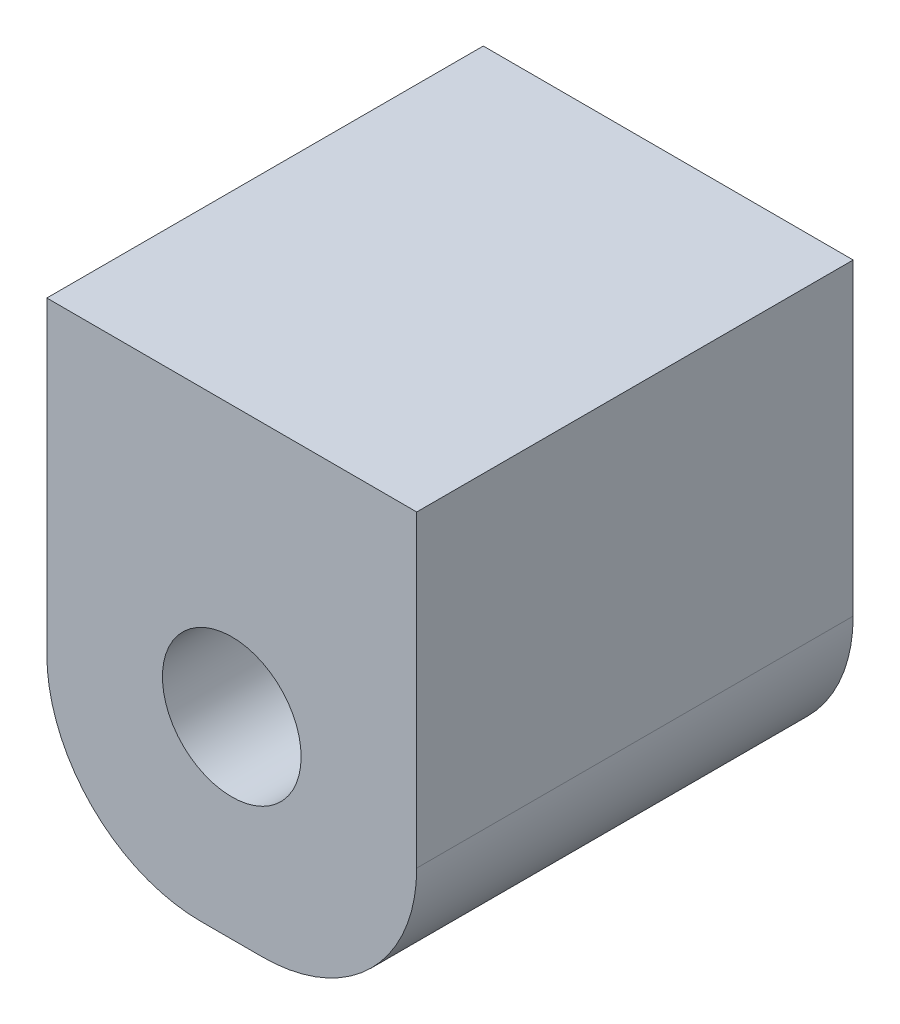
ISO-10303-21;
HEADER;
FILE_DESCRIPTION(('STEP AP214'),'2;1');
FILE_NAME('part.step','',(''),(''),'','','');
FILE_SCHEMA(('AUTOMOTIVE_DESIGN { 1 0 10303 214 1 1 1 1 }'));
ENDSEC;
DATA;
#1=APPLICATION_CONTEXT('core data for automotive mechanical design processes');
#2=APPLICATION_PROTOCOL_DEFINITION('international standard','automotive_design',2000,#1);
#3=PRODUCT_CONTEXT('',#1,'mechanical');
#4=PRODUCT('Part','Part','',(#3));
#5=PRODUCT_RELATED_PRODUCT_CATEGORY('part','',(#4));
#6=PRODUCT_DEFINITION_FORMATION('','',#4);
#7=PRODUCT_DEFINITION_CONTEXT('part definition',#1,'design');
#8=PRODUCT_DEFINITION('design','',#6,#7);
#9=PRODUCT_DEFINITION_SHAPE('','',#8);
#10=(LENGTH_UNIT() NAMED_UNIT(*) SI_UNIT(.MILLI.,.METRE.));
#11=(NAMED_UNIT(*) PLANE_ANGLE_UNIT() SI_UNIT($,.RADIAN.));
#12=(NAMED_UNIT(*) SI_UNIT($,.STERADIAN.) SOLID_ANGLE_UNIT());
#13=UNCERTAINTY_MEASURE_WITH_UNIT(LENGTH_MEASURE(1.E-05),#10,'distance_accuracy_value','');
#14=(GEOMETRIC_REPRESENTATION_CONTEXT(3) GLOBAL_UNCERTAINTY_ASSIGNED_CONTEXT((#13)) GLOBAL_UNIT_ASSIGNED_CONTEXT((#10,
#11,#12)) REPRESENTATION_CONTEXT('',''));
#15=CARTESIAN_POINT('',(0.,0.,0.));
#16=DIRECTION('',(0.,0.,1.));
#17=DIRECTION('',(1.,0.,0.));
#18=AXIS2_PLACEMENT_3D('',#15,#16,#17);
#19=CARTESIAN_POINT('',(0.,0.,28.32));
#20=DIRECTION('',(0.,0.,-1.));
#21=DIRECTION('',(-1.,0.,0.));
#22=AXIS2_PLACEMENT_3D('',#19,#20,#21);
#23=PLANE('',#22);
#24=DIRECTION('',(0.,-1.,0.));
#25=VECTOR('',#24,1.);
#26=CARTESIAN_POINT('',(14.5277983879841,-5.04493300678446,28.32));
#27=LINE('',#26,#25);
#28=CARTESIAN_POINT('',(14.5277983879841,-0.00856937765331077,28.32));
#29=VERTEX_POINT('',#28);
#30=CARTESIAN_POINT('',(14.5277983879841,-20.0449330067845,28.32));
#31=VERTEX_POINT('',#30);
#32=EDGE_CURVE('E123',#29,#31,#27,.T.);
#33=ORIENTED_EDGE('',*,*,#32,.T.);
#34=CARTESIAN_POINT('',(24.5277983879841,-20.0449330067845,28.32));
#35=DIRECTION('',(0.,0.,-1.));
#36=DIRECTION('',(-1.,0.,0.));
#37=AXIS2_PLACEMENT_3D('',#34,#35,#36);
#38=CIRCLE('',#37,10.);
#39=CARTESIAN_POINT('',(24.5277983879841,-30.0449330067845,28.32));
#40=VERTEX_POINT('',#39);
#41=EDGE_CURVE('E52',#31,#40,#38,.F.);
#42=ORIENTED_EDGE('',*,*,#41,.T.);
#43=DIRECTION('',(1.,0.,0.));
#44=VECTOR('',#43,1.);
#45=CARTESIAN_POINT('',(38.5277983879841,-30.0449330067845,28.32));
#46=LINE('',#45,#44);
#47=CARTESIAN_POINT('',(28.5277983879841,-30.0449330067845,28.32));
#48=VERTEX_POINT('',#47);
#49=EDGE_CURVE('E106',#40,#48,#46,.T.);
#50=ORIENTED_EDGE('',*,*,#49,.T.);
#51=CARTESIAN_POINT('',(28.5277983879841,-20.0449330067845,28.32));
#52=DIRECTION('',(0.,0.,-1.));
#53=DIRECTION('',(-1.,0.,0.));
#54=AXIS2_PLACEMENT_3D('',#51,#52,#53);
#55=CIRCLE('',#54,10.);
#56=CARTESIAN_POINT('',(38.5277983879841,-20.0449330067845,28.32));
#57=VERTEX_POINT('',#56);
#58=EDGE_CURVE('E59',#48,#57,#55,.F.);
#59=ORIENTED_EDGE('',*,*,#58,.T.);
#60=DIRECTION('',(0.,1.,0.));
#61=VECTOR('',#60,1.);
#62=CARTESIAN_POINT('',(38.5277983879841,-5.04493300678446,28.32));
#63=LINE('',#62,#61);
#64=CARTESIAN_POINT('',(38.5277983879841,-0.0328118142942987,28.32));
#65=VERTEX_POINT('',#64);
#66=EDGE_CURVE('E97',#57,#65,#63,.T.);
#67=ORIENTED_EDGE('',*,*,#66,.T.);
#68=DIRECTION('',(-0.999999489847843,0.00101010101140236,0.));
#69=VECTOR('',#68,1.);
#70=CARTESIAN_POINT('',(14.5277983879841,-0.00856937765331077,28.32));
#71=LINE('',#70,#69);
#72=EDGE_CURVE('E101',#65,#29,#71,.T.);
#73=ORIENTED_EDGE('',*,*,#72,.T.);
#74=EDGE_LOOP('',(#33,#42,#50,#59,#67,#73));
#75=FACE_BOUND('',#74,.T.);
#76=CARTESIAN_POINT('',(26.5277983879841,-17.5449330067845,28.32));
#77=DIRECTION('',(0.,0.,1.));
#78=DIRECTION('',(1.,0.,0.));
#79=AXIS2_PLACEMENT_3D('',#76,#77,#78);
#80=CIRCLE('',#79,4.5);
#81=CARTESIAN_POINT('',(31.0277983879841,-17.5449330067845,28.32));
#82=VERTEX_POINT('',#81);
#83=EDGE_CURVE('E133',#82,#82,#80,.T.);
#84=ORIENTED_EDGE('',*,*,#83,.F.);
#85=EDGE_LOOP('',(#84));
#86=FACE_BOUND('',#85,.T.);
#87=ADVANCED_FACE('F43',(#75,#86),#23,.F.);
#88=CARTESIAN_POINT('',(0.,0.,0.));
#89=DIRECTION('',(0.,0.,-1.));
#90=DIRECTION('',(-1.,0.,0.));
#91=AXIS2_PLACEMENT_3D('',#88,#89,#90);
#92=PLANE('',#91);
#93=DIRECTION('',(1.,0.,0.));
#94=VECTOR('',#93,1.);
#95=CARTESIAN_POINT('',(38.5277983879841,-30.0449330067845,0.));
#96=LINE('',#95,#94);
#97=CARTESIAN_POINT('',(24.5277983879841,-30.0449330067845,0.));
#98=VERTEX_POINT('',#97);
#99=CARTESIAN_POINT('',(28.5277983879841,-30.0449330067845,0.));
#100=VERTEX_POINT('',#99);
#101=EDGE_CURVE('E129',#98,#100,#96,.T.);
#102=ORIENTED_EDGE('',*,*,#101,.F.);
#103=CARTESIAN_POINT('',(24.5277983879841,-20.0449330067845,0.));
#104=DIRECTION('',(0.,0.,-1.));
#105=DIRECTION('',(-1.,0.,0.));
#106=AXIS2_PLACEMENT_3D('',#103,#104,#105);
#107=CIRCLE('',#106,10.);
#108=CARTESIAN_POINT('',(14.5277983879841,-20.0449330067845,0.));
#109=VERTEX_POINT('',#108);
#110=EDGE_CURVE('E153',#98,#109,#107,.T.);
#111=ORIENTED_EDGE('',*,*,#110,.T.);
#112=DIRECTION('',(0.,-1.,0.));
#113=VECTOR('',#112,1.);
#114=CARTESIAN_POINT('',(14.5277983879841,-30.0449330067845,0.));
#115=LINE('',#114,#113);
#116=CARTESIAN_POINT('',(14.5277983879841,-0.00856937765331077,0.));
#117=VERTEX_POINT('',#116);
#118=EDGE_CURVE('E139',#117,#109,#115,.T.);
#119=ORIENTED_EDGE('',*,*,#118,.F.);
#120=DIRECTION('',(-0.999999489847843,0.00101010101140236,0.));
#121=VECTOR('',#120,1.);
#122=CARTESIAN_POINT('',(14.5277983879841,-0.00856937765331077,0.));
#123=LINE('',#122,#121);
#124=CARTESIAN_POINT('',(38.5277983879841,-0.0328118142942987,0.));
#125=VERTEX_POINT('',#124);
#126=EDGE_CURVE('E136',#125,#117,#123,.T.);
#127=ORIENTED_EDGE('',*,*,#126,.F.);
#128=DIRECTION('',(0.,1.,0.));
#129=VECTOR('',#128,1.);
#130=CARTESIAN_POINT('',(38.5277983879841,-5.04493300678446,0.));
#131=LINE('',#130,#129);
#132=CARTESIAN_POINT('',(38.5277983879841,-20.0449330067845,0.));
#133=VERTEX_POINT('',#132);
#134=EDGE_CURVE('E112',#133,#125,#131,.T.);
#135=ORIENTED_EDGE('',*,*,#134,.F.);
#136=CARTESIAN_POINT('',(28.5277983879841,-20.0449330067845,0.));
#137=DIRECTION('',(0.,0.,-1.));
#138=DIRECTION('',(-1.,0.,0.));
#139=AXIS2_PLACEMENT_3D('',#136,#137,#138);
#140=CIRCLE('',#139,10.);
#141=EDGE_CURVE('E150',#133,#100,#140,.T.);
#142=ORIENTED_EDGE('',*,*,#141,.T.);
#143=EDGE_LOOP('',(#102,#111,#119,#127,#135,#142));
#144=FACE_BOUND('',#143,.T.);
#145=CARTESIAN_POINT('',(26.5277983879841,-17.5449330067845,0.));
#146=DIRECTION('',(0.,0.,1.));
#147=DIRECTION('',(1.,0.,0.));
#148=AXIS2_PLACEMENT_3D('',#145,#146,#147);
#149=CIRCLE('',#148,4.5);
#150=CARTESIAN_POINT('',(31.0277983879841,-17.5449330067845,0.));
#151=VERTEX_POINT('',#150);
#152=EDGE_CURVE('E276',#151,#151,#149,.T.);
#153=ORIENTED_EDGE('',*,*,#152,.T.);
#154=EDGE_LOOP('',(#153));
#155=FACE_BOUND('',#154,.T.);
#156=ADVANCED_FACE('F171',(#144,#155),#92,.T.);
#157=CARTESIAN_POINT('',(38.5277983879841,-30.0449330067845,28.32));
#158=DIRECTION('',(0.,1.,0.));
#159=DIRECTION('',(-1.,0.,0.));
#160=AXIS2_PLACEMENT_3D('',#157,#158,#159);
#161=PLANE('',#160);
#162=ORIENTED_EDGE('',*,*,#49,.F.);
#163=DIRECTION('',(0.,0.,-1.));
#164=VECTOR('',#163,1.);
#165=CARTESIAN_POINT('',(24.5277983879841,-30.0449330067845,28.32));
#166=LINE('',#165,#164);
#167=EDGE_CURVE('E146',#40,#98,#166,.T.);
#168=ORIENTED_EDGE('',*,*,#167,.T.);
#169=ORIENTED_EDGE('',*,*,#101,.T.);
#170=DIRECTION('',(0.,0.,-1.));
#171=VECTOR('',#170,1.);
#172=CARTESIAN_POINT('',(28.5277983879841,-30.0449330067845,28.32));
#173=LINE('',#172,#171);
#174=EDGE_CURVE('E117',#100,#48,#173,.F.);
#175=ORIENTED_EDGE('',*,*,#174,.T.);
#176=EDGE_LOOP('',(#162,#168,#169,#175));
#177=FACE_BOUND('',#176,.T.);
#178=ADVANCED_FACE('F165',(#177),#161,.F.);
#179=CARTESIAN_POINT('',(38.5277983879841,-5.04493300678446,28.32));
#180=DIRECTION('',(-1.,0.,0.));
#181=DIRECTION('',(0.,0.,1.));
#182=AXIS2_PLACEMENT_3D('',#179,#180,#181);
#183=PLANE('',#182);
#184=ORIENTED_EDGE('',*,*,#66,.F.);
#185=DIRECTION('',(0.,0.,-1.));
#186=VECTOR('',#185,1.);
#187=CARTESIAN_POINT('',(38.5277983879841,-20.0449330067845,28.32));
#188=LINE('',#187,#186);
#189=EDGE_CURVE('E11',#57,#133,#188,.T.);
#190=ORIENTED_EDGE('',*,*,#189,.T.);
#191=ORIENTED_EDGE('',*,*,#134,.T.);
#192=DIRECTION('',(0.,0.,-1.));
#193=VECTOR('',#192,1.);
#194=CARTESIAN_POINT('',(38.5277983879841,-0.0328118142942987,28.32));
#195=LINE('',#194,#193);
#196=EDGE_CURVE('E109',#65,#125,#195,.T.);
#197=ORIENTED_EDGE('',*,*,#196,.F.);
#198=EDGE_LOOP('',(#184,#190,#191,#197));
#199=FACE_BOUND('',#198,.T.);
#200=ADVANCED_FACE('F110',(#199),#183,.F.);
#201=CARTESIAN_POINT('',(14.5277983879841,-0.00856937765331077,28.32));
#202=DIRECTION('',(-0.00101010101140236,-0.999999489847843,0.));
#203=DIRECTION('',(0.999999489847843,-0.00101010101140236,0.));
#204=AXIS2_PLACEMENT_3D('',#201,#202,#203);
#205=PLANE('',#204);
#206=ORIENTED_EDGE('',*,*,#126,.T.);
#207=DIRECTION('',(0.,0.,-1.));
#208=VECTOR('',#207,1.);
#209=CARTESIAN_POINT('',(14.5277983879841,-0.00856937765331077,28.32));
#210=LINE('',#209,#208);
#211=EDGE_CURVE('E118',#29,#117,#210,.T.);
#212=ORIENTED_EDGE('',*,*,#211,.F.);
#213=ORIENTED_EDGE('',*,*,#72,.F.);
#214=ORIENTED_EDGE('',*,*,#196,.T.);
#215=EDGE_LOOP('',(#206,#212,#213,#214));
#216=FACE_BOUND('',#215,.T.);
#217=ADVANCED_FACE('F120',(#216),#205,.F.);
#218=CARTESIAN_POINT('',(14.5277983879841,-30.0449330067845,28.32));
#219=DIRECTION('',(1.,0.,0.));
#220=DIRECTION('',(0.,1.,0.));
#221=AXIS2_PLACEMENT_3D('',#218,#219,#220);
#222=PLANE('',#221);
#223=ORIENTED_EDGE('',*,*,#118,.T.);
#224=DIRECTION('',(0.,0.,-1.));
#225=VECTOR('',#224,1.);
#226=CARTESIAN_POINT('',(14.5277983879841,-20.0449330067845,28.32));
#227=LINE('',#226,#225);
#228=EDGE_CURVE('E67',#109,#31,#227,.F.);
#229=ORIENTED_EDGE('',*,*,#228,.T.);
#230=ORIENTED_EDGE('',*,*,#32,.F.);
#231=ORIENTED_EDGE('',*,*,#211,.T.);
#232=EDGE_LOOP('',(#223,#229,#230,#231));
#233=FACE_BOUND('',#232,.T.);
#234=ADVANCED_FACE('F173',(#233),#222,.F.);
#235=CARTESIAN_POINT('',(26.5277983879841,-17.5449330067845,28.32));
#236=DIRECTION('',(0.,0.,-1.));
#237=DIRECTION('',(-1.,0.,0.));
#238=AXIS2_PLACEMENT_3D('',#235,#236,#237);
#239=CYLINDRICAL_SURFACE('',#238,4.5);
#240=ORIENTED_EDGE('',*,*,#83,.T.);
#241=EDGE_LOOP('',(#240));
#242=FACE_BOUND('',#241,.T.);
#243=ORIENTED_EDGE('',*,*,#152,.F.);
#244=EDGE_LOOP('',(#243));
#245=FACE_BOUND('',#244,.T.);
#246=ADVANCED_FACE('F175',(#242,#245),#239,.F.);
#247=CARTESIAN_POINT('',(24.5277983879841,-20.0449330067845,28.32));
#248=DIRECTION('',(0.,0.,-1.));
#249=DIRECTION('',(-1.,0.,0.));
#250=AXIS2_PLACEMENT_3D('',#247,#248,#249);
#251=CYLINDRICAL_SURFACE('',#250,10.);
#252=ORIENTED_EDGE('',*,*,#41,.F.);
#253=ORIENTED_EDGE('',*,*,#228,.F.);
#254=ORIENTED_EDGE('',*,*,#110,.F.);
#255=ORIENTED_EDGE('',*,*,#167,.F.);
#256=EDGE_LOOP('',(#252,#253,#254,#255));
#257=FACE_BOUND('',#256,.T.);
#258=ADVANCED_FACE('F169',(#257),#251,.T.);
#259=CARTESIAN_POINT('',(28.5277983879841,-20.0449330067845,28.32));
#260=DIRECTION('',(0.,0.,-1.));
#261=DIRECTION('',(-1.,0.,0.));
#262=AXIS2_PLACEMENT_3D('',#259,#260,#261);
#263=CYLINDRICAL_SURFACE('',#262,10.);
#264=ORIENTED_EDGE('',*,*,#58,.F.);
#265=ORIENTED_EDGE('',*,*,#174,.F.);
#266=ORIENTED_EDGE('',*,*,#141,.F.);
#267=ORIENTED_EDGE('',*,*,#189,.F.);
#268=EDGE_LOOP('',(#264,#265,#266,#267));
#269=FACE_BOUND('',#268,.T.);
#270=ADVANCED_FACE('F45',(#269),#263,.T.);
#271=CLOSED_SHELL('',(#87,#156,#178,#200,#217,#234,#246,#258,#270));
#272=MANIFOLD_SOLID_BREP('B2',#271);
#273=ADVANCED_BREP_SHAPE_REPRESENTATION('',(#18,#272),#14);
#274=SHAPE_DEFINITION_REPRESENTATION(#9,#273);
ENDSEC;
END-ISO-10303-21;
